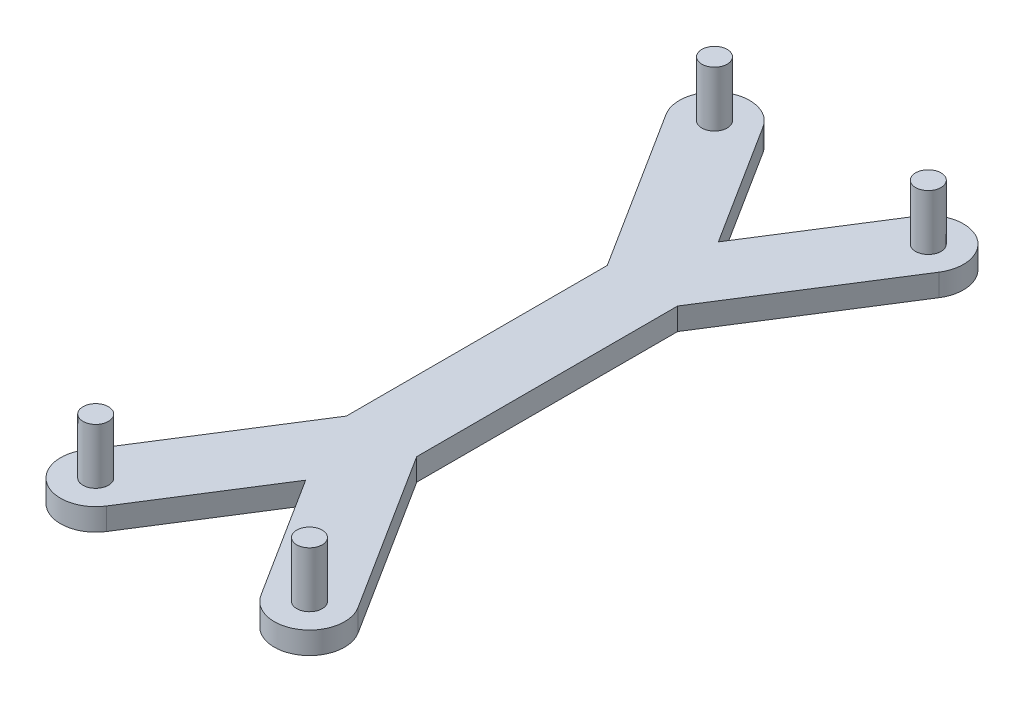
ISO-10303-21;
HEADER;
FILE_DESCRIPTION(('STEP AP214'),'2;1');
FILE_NAME('part.step','',(''),(''),'','','');
FILE_SCHEMA(('AUTOMOTIVE_DESIGN { 1 0 10303 214 1 1 1 1 }'));
ENDSEC;
DATA;
#1=APPLICATION_CONTEXT('core data for automotive mechanical design processes');
#2=APPLICATION_PROTOCOL_DEFINITION('international standard','automotive_design',2000,#1);
#3=PRODUCT_CONTEXT('',#1,'mechanical');
#4=PRODUCT('Part','Part','',(#3));
#5=PRODUCT_RELATED_PRODUCT_CATEGORY('part','',(#4));
#6=PRODUCT_DEFINITION_FORMATION('','',#4);
#7=PRODUCT_DEFINITION_CONTEXT('part definition',#1,'design');
#8=PRODUCT_DEFINITION('design','',#6,#7);
#9=PRODUCT_DEFINITION_SHAPE('','',#8);
#10=(LENGTH_UNIT() NAMED_UNIT(*) SI_UNIT(.MILLI.,.METRE.));
#11=(NAMED_UNIT(*) PLANE_ANGLE_UNIT() SI_UNIT($,.RADIAN.));
#12=(NAMED_UNIT(*) SI_UNIT($,.STERADIAN.) SOLID_ANGLE_UNIT());
#13=UNCERTAINTY_MEASURE_WITH_UNIT(LENGTH_MEASURE(1.E-05),#10,'distance_accuracy_value','');
#14=(GEOMETRIC_REPRESENTATION_CONTEXT(3) GLOBAL_UNCERTAINTY_ASSIGNED_CONTEXT((#13)) GLOBAL_UNIT_ASSIGNED_CONTEXT((#10,
#11,#12)) REPRESENTATION_CONTEXT('',''));
#15=CARTESIAN_POINT('',(0.,0.,0.));
#16=DIRECTION('',(0.,0.,1.));
#17=DIRECTION('',(1.,0.,0.));
#18=AXIS2_PLACEMENT_3D('',#15,#16,#17);
#19=CARTESIAN_POINT('',(8.42298256329863,-2.,5.33455562342247));
#20=DIRECTION('',(0.844819075554229,0.,0.535052081184345));
#21=DIRECTION('',(0.535052081184345,0.,-0.844819075554229));
#22=AXIS2_PLACEMENT_3D('',#19,#20,#21);
#23=PLANE('',#22);
#24=DIRECTION('',(0.535052081184345,0.,-0.844819075554229));
#25=VECTOR('',#24,1.);
#26=CARTESIAN_POINT('',(8.42298256329863,0.,5.33455562342247));
#27=LINE('',#26,#25);
#28=CARTESIAN_POINT('',(-6.96969943511532,0.,29.6387903577603));
#29=VERTEX_POINT('',#28);
#30=CARTESIAN_POINT('',(0.,0.,18.6340017759993));
#31=VERTEX_POINT('',#30);
#32=EDGE_CURVE('E205',#29,#31,#27,.T.);
#33=ORIENTED_EDGE('',*,*,#32,.F.);
#34=DIRECTION('',(0.,1.,0.));
#35=VECTOR('',#34,1.);
#36=CARTESIAN_POINT('',(-6.96969943511532,-2.,29.6387903577603));
#37=LINE('',#36,#35);
#38=CARTESIAN_POINT('',(-6.96969943511532,-2.,29.6387903577603));
#39=VERTEX_POINT('',#38);
#40=EDGE_CURVE('E12',#39,#29,#37,.T.);
#41=ORIENTED_EDGE('',*,*,#40,.F.);
#42=DIRECTION('',(0.535052081184345,0.,-0.844819075554229));
#43=VECTOR('',#42,1.);
#44=CARTESIAN_POINT('',(8.42298256329863,-2.,5.33455562342247));
#45=LINE('',#44,#43);
#46=CARTESIAN_POINT('',(0.,-2.,18.6340017759993));
#47=VERTEX_POINT('',#46);
#48=EDGE_CURVE('E267',#39,#47,#45,.T.);
#49=ORIENTED_EDGE('',*,*,#48,.T.);
#50=DIRECTION('',(0.,1.,0.));
#51=VECTOR('',#50,1.);
#52=CARTESIAN_POINT('',(0.,-2.,18.6340017759993));
#53=LINE('',#52,#51);
#54=EDGE_CURVE('E51',#47,#31,#53,.T.);
#55=ORIENTED_EDGE('',*,*,#54,.T.);
#56=EDGE_LOOP('',(#33,#41,#49,#55));
#57=FACE_BOUND('',#56,.T.);
#58=ADVANCED_FACE('F48',(#57),#23,.T.);
#59=CARTESIAN_POINT('',(-9.652,-2.,27.94));
#60=DIRECTION('',(0.,1.,0.));
#61=DIRECTION('',(0.,0.,1.));
#62=AXIS2_PLACEMENT_3D('',#59,#60,#61);
#63=CYLINDRICAL_SURFACE('',#62,3.175);
#64=CARTESIAN_POINT('',(-9.652,0.,27.94));
#65=DIRECTION('',(0.,1.,0.));
#66=DIRECTION('',(0.,0.,1.));
#67=AXIS2_PLACEMENT_3D('',#64,#65,#66);
#68=CIRCLE('',#67,3.175);
#69=CARTESIAN_POINT('',(-12.3343005648847,0.,26.2412096422397));
#70=VERTEX_POINT('',#69);
#71=EDGE_CURVE('E112',#29,#70,#68,.F.);
#72=ORIENTED_EDGE('',*,*,#71,.T.);
#73=DIRECTION('',(0.,1.,0.));
#74=VECTOR('',#73,1.);
#75=CARTESIAN_POINT('',(-12.3343005648847,-2.,26.2412096422397));
#76=LINE('',#75,#74);
#77=CARTESIAN_POINT('',(-12.3343005648847,-2.,26.2412096422397));
#78=VERTEX_POINT('',#77);
#79=EDGE_CURVE('E58',#78,#70,#76,.T.);
#80=ORIENTED_EDGE('',*,*,#79,.F.);
#81=CARTESIAN_POINT('',(-9.652,-2.,27.94));
#82=DIRECTION('',(0.,1.,0.));
#83=DIRECTION('',(0.,0.,1.));
#84=AXIS2_PLACEMENT_3D('',#81,#82,#83);
#85=CIRCLE('',#84,3.175);
#86=EDGE_CURVE('E163',#39,#78,#85,.F.);
#87=ORIENTED_EDGE('',*,*,#86,.F.);
#88=ORIENTED_EDGE('',*,*,#40,.T.);
#89=EDGE_LOOP('',(#72,#80,#87,#88));
#90=FACE_BOUND('',#89,.T.);
#91=ADVANCED_FACE('F387',(#90),#63,.T.);
#92=CARTESIAN_POINT('',(3.05838143352928,-2.,1.93697490790188));
#93=DIRECTION('',(0.844819075554229,0.,0.535052081184345));
#94=DIRECTION('',(0.535052081184345,0.,-0.844819075554229));
#95=AXIS2_PLACEMENT_3D('',#92,#93,#94);
#96=PLANE('',#95);
#97=DIRECTION('',(0.535052081184345,0.,-0.844819075554229));
#98=VECTOR('',#97,1.);
#99=CARTESIAN_POINT('',(3.05838143352928,0.,1.93697490790188));
#100=LINE('',#99,#98);
#101=CARTESIAN_POINT('',(-3.175,0.,11.7791561187376));
#102=VERTEX_POINT('',#101);
#103=EDGE_CURVE('E171',#70,#102,#100,.T.);
#104=ORIENTED_EDGE('',*,*,#103,.T.);
#105=DIRECTION('',(0.,1.,0.));
#106=VECTOR('',#105,1.);
#107=CARTESIAN_POINT('',(-3.175,-2.,11.7791561187376));
#108=LINE('',#107,#106);
#109=CARTESIAN_POINT('',(-3.175,-2.,11.7791561187376));
#110=VERTEX_POINT('',#109);
#111=EDGE_CURVE('E168',#110,#102,#108,.T.);
#112=ORIENTED_EDGE('',*,*,#111,.F.);
#113=DIRECTION('',(0.535052081184345,0.,-0.844819075554229));
#114=VECTOR('',#113,1.);
#115=CARTESIAN_POINT('',(3.05838143352928,-2.,1.93697490790188));
#116=LINE('',#115,#114);
#117=EDGE_CURVE('E155',#78,#110,#116,.T.);
#118=ORIENTED_EDGE('',*,*,#117,.F.);
#119=ORIENTED_EDGE('',*,*,#79,.T.);
#120=EDGE_LOOP('',(#104,#112,#118,#119));
#121=FACE_BOUND('',#120,.T.);
#122=ADVANCED_FACE('F169',(#121),#96,.F.);
#123=CARTESIAN_POINT('',(-3.175,-2.,0.));
#124=DIRECTION('',(-1.,0.,0.));
#125=DIRECTION('',(0.,0.,1.));
#126=AXIS2_PLACEMENT_3D('',#123,#124,#125);
#127=PLANE('',#126);
#128=DIRECTION('',(0.,0.,1.));
#129=VECTOR('',#128,1.);
#130=CARTESIAN_POINT('',(-3.175,0.,0.));
#131=LINE('',#130,#129);
#132=CARTESIAN_POINT('',(-3.175,0.,-11.7791561187376));
#133=VERTEX_POINT('',#132);
#134=EDGE_CURVE('E245',#133,#102,#131,.T.);
#135=ORIENTED_EDGE('',*,*,#134,.F.);
#136=DIRECTION('',(0.,1.,0.));
#137=VECTOR('',#136,1.);
#138=CARTESIAN_POINT('',(-3.175,-2.,-11.7791561187376));
#139=LINE('',#138,#137);
#140=CARTESIAN_POINT('',(-3.175,-2.,-11.7791561187376));
#141=VERTEX_POINT('',#140);
#142=EDGE_CURVE('E176',#141,#133,#139,.T.);
#143=ORIENTED_EDGE('',*,*,#142,.F.);
#144=DIRECTION('',(0.,0.,1.));
#145=VECTOR('',#144,1.);
#146=CARTESIAN_POINT('',(-3.175,-2.,0.));
#147=LINE('',#146,#145);
#148=EDGE_CURVE('E161',#141,#110,#147,.T.);
#149=ORIENTED_EDGE('',*,*,#148,.T.);
#150=ORIENTED_EDGE('',*,*,#111,.T.);
#151=EDGE_LOOP('',(#135,#143,#149,#150));
#152=FACE_BOUND('',#151,.T.);
#153=ADVANCED_FACE('F178',(#152),#127,.T.);
#154=CARTESIAN_POINT('',(3.05838143352928,-2.,-1.93697490790188));
#155=DIRECTION('',(-0.844819075554229,0.,0.535052081184345));
#156=DIRECTION('',(0.535052081184345,0.,0.844819075554229));
#157=AXIS2_PLACEMENT_3D('',#154,#155,#156);
#158=PLANE('',#157);
#159=DIRECTION('',(0.535052081184345,0.,0.844819075554229));
#160=VECTOR('',#159,1.);
#161=CARTESIAN_POINT('',(3.05838143352928,0.,-1.93697490790188));
#162=LINE('',#161,#160);
#163=CARTESIAN_POINT('',(-12.3343005648847,0.,-26.2412096422397));
#164=VERTEX_POINT('',#163);
#165=EDGE_CURVE('E241',#164,#133,#162,.T.);
#166=ORIENTED_EDGE('',*,*,#165,.F.);
#167=DIRECTION('',(0.,1.,0.));
#168=VECTOR('',#167,1.);
#169=CARTESIAN_POINT('',(-12.3343005648847,-2.,-26.2412096422397));
#170=LINE('',#169,#168);
#171=CARTESIAN_POINT('',(-12.3343005648847,-2.,-26.2412096422397));
#172=VERTEX_POINT('',#171);
#173=EDGE_CURVE('E273',#172,#164,#170,.T.);
#174=ORIENTED_EDGE('',*,*,#173,.F.);
#175=DIRECTION('',(0.535052081184345,0.,0.844819075554229));
#176=VECTOR('',#175,1.);
#177=CARTESIAN_POINT('',(3.05838143352928,-2.,-1.93697490790188));
#178=LINE('',#177,#176);
#179=EDGE_CURVE('E180',#172,#141,#178,.T.);
#180=ORIENTED_EDGE('',*,*,#179,.T.);
#181=ORIENTED_EDGE('',*,*,#142,.T.);
#182=EDGE_LOOP('',(#166,#174,#180,#181));
#183=FACE_BOUND('',#182,.T.);
#184=ADVANCED_FACE('F315',(#183),#158,.T.);
#185=CARTESIAN_POINT('',(-9.652,-2.,-27.94));
#186=DIRECTION('',(0.,1.,0.));
#187=DIRECTION('',(0.,0.,1.));
#188=AXIS2_PLACEMENT_3D('',#185,#186,#187);
#189=CYLINDRICAL_SURFACE('',#188,3.175);
#190=CARTESIAN_POINT('',(-9.652,0.,-27.94));
#191=DIRECTION('',(0.,1.,0.));
#192=DIRECTION('',(0.,0.,1.));
#193=AXIS2_PLACEMENT_3D('',#190,#191,#192);
#194=CIRCLE('',#193,3.175);
#195=CARTESIAN_POINT('',(-6.96969943511533,0.,-29.6387903577603));
#196=VERTEX_POINT('',#195);
#197=EDGE_CURVE('E238',#164,#196,#194,.F.);
#198=ORIENTED_EDGE('',*,*,#197,.T.);
#199=DIRECTION('',(0.,1.,0.));
#200=VECTOR('',#199,1.);
#201=CARTESIAN_POINT('',(-6.96969943511533,-2.,-29.6387903577603));
#202=LINE('',#201,#200);
#203=CARTESIAN_POINT('',(-6.96969943511533,-2.,-29.6387903577603));
#204=VERTEX_POINT('',#203);
#205=EDGE_CURVE('E276',#204,#196,#202,.T.);
#206=ORIENTED_EDGE('',*,*,#205,.F.);
#207=CARTESIAN_POINT('',(-9.652,-2.,-27.94));
#208=DIRECTION('',(0.,1.,0.));
#209=DIRECTION('',(0.,0.,1.));
#210=AXIS2_PLACEMENT_3D('',#207,#208,#209);
#211=CIRCLE('',#210,3.175);
#212=EDGE_CURVE('E183',#172,#204,#211,.F.);
#213=ORIENTED_EDGE('',*,*,#212,.F.);
#214=ORIENTED_EDGE('',*,*,#173,.T.);
#215=EDGE_LOOP('',(#198,#206,#213,#214));
#216=FACE_BOUND('',#215,.T.);
#217=ADVANCED_FACE('F324',(#216),#189,.T.);
#218=CARTESIAN_POINT('',(8.42298256329864,-2.,-5.33455562342247));
#219=DIRECTION('',(-0.844819075554229,0.,0.535052081184345));
#220=DIRECTION('',(0.535052081184345,0.,0.844819075554229));
#221=AXIS2_PLACEMENT_3D('',#218,#219,#220);
#222=PLANE('',#221);
#223=DIRECTION('',(0.535052081184345,0.,0.844819075554229));
#224=VECTOR('',#223,1.);
#225=CARTESIAN_POINT('',(8.42298256329864,0.,-5.33455562342247));
#226=LINE('',#225,#224);
#227=CARTESIAN_POINT('',(0.,0.,-18.6340017759993));
#228=VERTEX_POINT('',#227);
#229=EDGE_CURVE('E234',#196,#228,#226,.T.);
#230=ORIENTED_EDGE('',*,*,#229,.T.);
#231=DIRECTION('',(0.,1.,0.));
#232=VECTOR('',#231,1.);
#233=CARTESIAN_POINT('',(0.,-2.,-18.6340017759993));
#234=LINE('',#233,#232);
#235=CARTESIAN_POINT('',(0.,-2.,-18.6340017759993));
#236=VERTEX_POINT('',#235);
#237=EDGE_CURVE('E280',#236,#228,#234,.T.);
#238=ORIENTED_EDGE('',*,*,#237,.F.);
#239=DIRECTION('',(0.535052081184345,0.,0.844819075554229));
#240=VECTOR('',#239,1.);
#241=CARTESIAN_POINT('',(8.42298256329864,-2.,-5.33455562342247));
#242=LINE('',#241,#240);
#243=EDGE_CURVE('E320',#204,#236,#242,.T.);
#244=ORIENTED_EDGE('',*,*,#243,.F.);
#245=ORIENTED_EDGE('',*,*,#205,.T.);
#246=EDGE_LOOP('',(#230,#238,#244,#245));
#247=FACE_BOUND('',#246,.T.);
#248=ADVANCED_FACE('F326',(#247),#222,.F.);
#249=CARTESIAN_POINT('',(-8.42298256329864,-2.,-5.33455562342247));
#250=DIRECTION('',(-0.844819075554229,0.,-0.535052081184345));
#251=DIRECTION('',(-0.535052081184345,0.,0.844819075554229));
#252=AXIS2_PLACEMENT_3D('',#249,#250,#251);
#253=PLANE('',#252);
#254=DIRECTION('',(-0.535052081184345,0.,0.844819075554229));
#255=VECTOR('',#254,1.);
#256=CARTESIAN_POINT('',(-8.42298256329864,0.,-5.33455562342247));
#257=LINE('',#256,#255);
#258=CARTESIAN_POINT('',(6.96969943511532,0.,-29.6387903577603));
#259=VERTEX_POINT('',#258);
#260=EDGE_CURVE('E230',#259,#228,#257,.T.);
#261=ORIENTED_EDGE('',*,*,#260,.F.);
#262=DIRECTION('',(0.,1.,0.));
#263=VECTOR('',#262,1.);
#264=CARTESIAN_POINT('',(6.96969943511532,-2.,-29.6387903577603));
#265=LINE('',#264,#263);
#266=CARTESIAN_POINT('',(6.96969943511532,-2.,-29.6387903577603));
#267=VERTEX_POINT('',#266);
#268=EDGE_CURVE('E283',#267,#259,#265,.T.);
#269=ORIENTED_EDGE('',*,*,#268,.F.);
#270=DIRECTION('',(-0.535052081184345,0.,0.844819075554229));
#271=VECTOR('',#270,1.);
#272=CARTESIAN_POINT('',(-8.42298256329864,-2.,-5.33455562342247));
#273=LINE('',#272,#271);
#274=EDGE_CURVE('E329',#267,#236,#273,.T.);
#275=ORIENTED_EDGE('',*,*,#274,.T.);
#276=ORIENTED_EDGE('',*,*,#237,.T.);
#277=EDGE_LOOP('',(#261,#269,#275,#276));
#278=FACE_BOUND('',#277,.T.);
#279=ADVANCED_FACE('F377',(#278),#253,.T.);
#280=CARTESIAN_POINT('',(9.652,-2.,-27.94));
#281=DIRECTION('',(0.,1.,0.));
#282=DIRECTION('',(0.,0.,1.));
#283=AXIS2_PLACEMENT_3D('',#280,#281,#282);
#284=CYLINDRICAL_SURFACE('',#283,3.175);
#285=CARTESIAN_POINT('',(9.652,0.,-27.94));
#286=DIRECTION('',(0.,1.,0.));
#287=DIRECTION('',(0.,0.,1.));
#288=AXIS2_PLACEMENT_3D('',#285,#286,#287);
#289=CIRCLE('',#288,3.175);
#290=CARTESIAN_POINT('',(12.3343005648847,0.,-26.2412096422397));
#291=VERTEX_POINT('',#290);
#292=EDGE_CURVE('E227',#259,#291,#289,.F.);
#293=ORIENTED_EDGE('',*,*,#292,.T.);
#294=DIRECTION('',(0.,1.,0.));
#295=VECTOR('',#294,1.);
#296=CARTESIAN_POINT('',(12.3343005648847,-2.,-26.2412096422397));
#297=LINE('',#296,#295);
#298=CARTESIAN_POINT('',(12.3343005648847,-2.,-26.2412096422397));
#299=VERTEX_POINT('',#298);
#300=EDGE_CURVE('E286',#299,#291,#297,.T.);
#301=ORIENTED_EDGE('',*,*,#300,.F.);
#302=CARTESIAN_POINT('',(9.652,-2.,-27.94));
#303=DIRECTION('',(0.,1.,0.));
#304=DIRECTION('',(0.,0.,1.));
#305=AXIS2_PLACEMENT_3D('',#302,#303,#304);
#306=CIRCLE('',#305,3.175);
#307=EDGE_CURVE('E332',#267,#299,#306,.F.);
#308=ORIENTED_EDGE('',*,*,#307,.F.);
#309=ORIENTED_EDGE('',*,*,#268,.T.);
#310=EDGE_LOOP('',(#293,#301,#308,#309));
#311=FACE_BOUND('',#310,.T.);
#312=ADVANCED_FACE('F375',(#311),#284,.T.);
#313=CARTESIAN_POINT('',(-3.05838143352929,-2.,-1.93697490790188));
#314=DIRECTION('',(-0.844819075554229,0.,-0.535052081184345));
#315=DIRECTION('',(-0.535052081184345,0.,0.844819075554229));
#316=AXIS2_PLACEMENT_3D('',#313,#314,#315);
#317=PLANE('',#316);
#318=DIRECTION('',(-0.535052081184345,0.,0.844819075554229));
#319=VECTOR('',#318,1.);
#320=CARTESIAN_POINT('',(-3.05838143352929,0.,-1.93697490790188));
#321=LINE('',#320,#319);
#322=CARTESIAN_POINT('',(3.175,0.,-11.7791561187376));
#323=VERTEX_POINT('',#322);
#324=EDGE_CURVE('E224',#291,#323,#321,.T.);
#325=ORIENTED_EDGE('',*,*,#324,.T.);
#326=DIRECTION('',(0.,1.,0.));
#327=VECTOR('',#326,1.);
#328=CARTESIAN_POINT('',(3.175,-2.,-11.7791561187376));
#329=LINE('',#328,#327);
#330=CARTESIAN_POINT('',(3.175,-2.,-11.7791561187376));
#331=VERTEX_POINT('',#330);
#332=EDGE_CURVE('E290',#331,#323,#329,.T.);
#333=ORIENTED_EDGE('',*,*,#332,.F.);
#334=DIRECTION('',(-0.535052081184345,0.,0.844819075554229));
#335=VECTOR('',#334,1.);
#336=CARTESIAN_POINT('',(-3.05838143352929,-2.,-1.93697490790188));
#337=LINE('',#336,#335);
#338=EDGE_CURVE('E337',#299,#331,#337,.T.);
#339=ORIENTED_EDGE('',*,*,#338,.F.);
#340=ORIENTED_EDGE('',*,*,#300,.T.);
#341=EDGE_LOOP('',(#325,#333,#339,#340));
#342=FACE_BOUND('',#341,.T.);
#343=ADVANCED_FACE('F370',(#342),#317,.F.);
#344=CARTESIAN_POINT('',(3.175,-2.,0.));
#345=DIRECTION('',(-1.,0.,0.));
#346=DIRECTION('',(0.,0.,1.));
#347=AXIS2_PLACEMENT_3D('',#344,#345,#346);
#348=PLANE('',#347);
#349=DIRECTION('',(0.,0.,1.));
#350=VECTOR('',#349,1.);
#351=CARTESIAN_POINT('',(3.175,0.,0.));
#352=LINE('',#351,#350);
#353=CARTESIAN_POINT('',(3.175,0.,11.7791561187376));
#354=VERTEX_POINT('',#353);
#355=EDGE_CURVE('E220',#323,#354,#352,.T.);
#356=ORIENTED_EDGE('',*,*,#355,.T.);
#357=DIRECTION('',(0.,1.,0.));
#358=VECTOR('',#357,1.);
#359=CARTESIAN_POINT('',(3.175,-2.,11.7791561187376));
#360=LINE('',#359,#358);
#361=CARTESIAN_POINT('',(3.175,-2.,11.7791561187376));
#362=VERTEX_POINT('',#361);
#363=EDGE_CURVE('E294',#362,#354,#360,.T.);
#364=ORIENTED_EDGE('',*,*,#363,.F.);
#365=DIRECTION('',(0.,0.,1.));
#366=VECTOR('',#365,1.);
#367=CARTESIAN_POINT('',(3.175,-2.,0.));
#368=LINE('',#367,#366);
#369=EDGE_CURVE('E340',#331,#362,#368,.T.);
#370=ORIENTED_EDGE('',*,*,#369,.F.);
#371=ORIENTED_EDGE('',*,*,#332,.T.);
#372=EDGE_LOOP('',(#356,#364,#370,#371));
#373=FACE_BOUND('',#372,.T.);
#374=ADVANCED_FACE('F364',(#373),#348,.F.);
#375=CARTESIAN_POINT('',(-3.05838143352928,-2.,1.93697490790188));
#376=DIRECTION('',(0.844819075554229,0.,-0.535052081184345));
#377=DIRECTION('',(-0.535052081184345,0.,-0.844819075554229));
#378=AXIS2_PLACEMENT_3D('',#375,#376,#377);
#379=PLANE('',#378);
#380=DIRECTION('',(-0.535052081184345,0.,-0.844819075554229));
#381=VECTOR('',#380,1.);
#382=CARTESIAN_POINT('',(-3.05838143352928,0.,1.93697490790188));
#383=LINE('',#382,#381);
#384=CARTESIAN_POINT('',(12.3343005648847,0.,26.2412096422397));
#385=VERTEX_POINT('',#384);
#386=EDGE_CURVE('E216',#385,#354,#383,.T.);
#387=ORIENTED_EDGE('',*,*,#386,.F.);
#388=DIRECTION('',(0.,1.,0.));
#389=VECTOR('',#388,1.);
#390=CARTESIAN_POINT('',(12.3343005648847,-2.,26.2412096422397));
#391=LINE('',#390,#389);
#392=CARTESIAN_POINT('',(12.3343005648847,-2.,26.2412096422397));
#393=VERTEX_POINT('',#392);
#394=EDGE_CURVE('E297',#393,#385,#391,.T.);
#395=ORIENTED_EDGE('',*,*,#394,.F.);
#396=DIRECTION('',(-0.535052081184345,0.,-0.844819075554229));
#397=VECTOR('',#396,1.);
#398=CARTESIAN_POINT('',(-3.05838143352928,-2.,1.93697490790188));
#399=LINE('',#398,#397);
#400=EDGE_CURVE('E343',#393,#362,#399,.T.);
#401=ORIENTED_EDGE('',*,*,#400,.T.);
#402=ORIENTED_EDGE('',*,*,#363,.T.);
#403=EDGE_LOOP('',(#387,#395,#401,#402));
#404=FACE_BOUND('',#403,.T.);
#405=ADVANCED_FACE('F360',(#404),#379,.T.);
#406=CARTESIAN_POINT('',(9.652,-2.,27.94));
#407=DIRECTION('',(0.,1.,0.));
#408=DIRECTION('',(0.,0.,1.));
#409=AXIS2_PLACEMENT_3D('',#406,#407,#408);
#410=CYLINDRICAL_SURFACE('',#409,3.175);
#411=CARTESIAN_POINT('',(9.652,0.,27.94));
#412=DIRECTION('',(0.,1.,0.));
#413=DIRECTION('',(0.,0.,1.));
#414=AXIS2_PLACEMENT_3D('',#411,#412,#413);
#415=CIRCLE('',#414,3.175);
#416=CARTESIAN_POINT('',(6.96969943511533,0.,29.6387903577603));
#417=VERTEX_POINT('',#416);
#418=EDGE_CURVE('E213',#385,#417,#415,.F.);
#419=ORIENTED_EDGE('',*,*,#418,.T.);
#420=DIRECTION('',(0.,1.,0.));
#421=VECTOR('',#420,1.);
#422=CARTESIAN_POINT('',(6.96969943511533,-2.,29.6387903577603));
#423=LINE('',#422,#421);
#424=CARTESIAN_POINT('',(6.96969943511533,-2.,29.6387903577603));
#425=VERTEX_POINT('',#424);
#426=EDGE_CURVE('E299',#425,#417,#423,.T.);
#427=ORIENTED_EDGE('',*,*,#426,.F.);
#428=CARTESIAN_POINT('',(9.652,-2.,27.94));
#429=DIRECTION('',(0.,1.,0.));
#430=DIRECTION('',(0.,0.,1.));
#431=AXIS2_PLACEMENT_3D('',#428,#429,#430);
#432=CIRCLE('',#431,3.175);
#433=EDGE_CURVE('E347',#393,#425,#432,.F.);
#434=ORIENTED_EDGE('',*,*,#433,.F.);
#435=ORIENTED_EDGE('',*,*,#394,.T.);
#436=EDGE_LOOP('',(#419,#427,#434,#435));
#437=FACE_BOUND('',#436,.T.);
#438=ADVANCED_FACE('F356',(#437),#410,.T.);
#439=CARTESIAN_POINT('',(-9.652,-2.,27.94));
#440=DIRECTION('',(0.,1.,0.));
#441=DIRECTION('',(0.,0.,1.));
#442=AXIS2_PLACEMENT_3D('',#439,#440,#441);
#443=CYLINDRICAL_SURFACE('',#442,1.15);
#444=CARTESIAN_POINT('',(-9.652,-2.,27.94));
#445=DIRECTION('',(0.,1.,0.));
#446=DIRECTION('',(0.,0.,1.));
#447=AXIS2_PLACEMENT_3D('',#444,#445,#446);
#448=CIRCLE('',#447,1.15);
#449=CARTESIAN_POINT('',(-9.652,-2.,29.09));
#450=VERTEX_POINT('',#449);
#451=EDGE_CURVE('E197',#450,#450,#448,.F.);
#452=ORIENTED_EDGE('',*,*,#451,.T.);
#453=EDGE_LOOP('',(#452));
#454=FACE_BOUND('',#453,.T.);
#455=CARTESIAN_POINT('',(-9.652,0.,27.94));
#456=DIRECTION('',(0.,1.,0.));
#457=DIRECTION('',(0.,0.,1.));
#458=AXIS2_PLACEMENT_3D('',#455,#456,#457);
#459=CIRCLE('',#458,1.15);
#460=CARTESIAN_POINT('',(-9.652,0.,29.09));
#461=VERTEX_POINT('',#460);
#462=EDGE_CURVE('E260',#461,#461,#459,.F.);
#463=ORIENTED_EDGE('',*,*,#462,.F.);
#464=EDGE_LOOP('',(#463));
#465=FACE_BOUND('',#464,.T.);
#466=ADVANCED_FACE('F456',(#454,#465),#443,.F.);
#467=CARTESIAN_POINT('',(9.652,-2.,-27.94));
#468=DIRECTION('',(0.,1.,0.));
#469=DIRECTION('',(0.,0.,1.));
#470=AXIS2_PLACEMENT_3D('',#467,#468,#469);
#471=CYLINDRICAL_SURFACE('',#470,1.15);
#472=CARTESIAN_POINT('',(9.652,-2.,-27.94));
#473=DIRECTION('',(0.,1.,0.));
#474=DIRECTION('',(0.,0.,1.));
#475=AXIS2_PLACEMENT_3D('',#472,#473,#474);
#476=CIRCLE('',#475,1.15);
#477=CARTESIAN_POINT('',(9.652,-2.,-26.79));
#478=VERTEX_POINT('',#477);
#479=EDGE_CURVE('E193',#478,#478,#476,.F.);
#480=ORIENTED_EDGE('',*,*,#479,.T.);
#481=EDGE_LOOP('',(#480));
#482=FACE_BOUND('',#481,.T.);
#483=CARTESIAN_POINT('',(9.652,0.,-27.94));
#484=DIRECTION('',(0.,1.,0.));
#485=DIRECTION('',(0.,0.,1.));
#486=AXIS2_PLACEMENT_3D('',#483,#484,#485);
#487=CIRCLE('',#486,1.15);
#488=CARTESIAN_POINT('',(9.652,0.,-26.79));
#489=VERTEX_POINT('',#488);
#490=EDGE_CURVE('E256',#489,#489,#487,.F.);
#491=ORIENTED_EDGE('',*,*,#490,.F.);
#492=EDGE_LOOP('',(#491));
#493=FACE_BOUND('',#492,.T.);
#494=ADVANCED_FACE('F465',(#482,#493),#471,.F.);
#495=CARTESIAN_POINT('',(-9.652,-2.,-27.94));
#496=DIRECTION('',(0.,1.,0.));
#497=DIRECTION('',(0.,0.,1.));
#498=AXIS2_PLACEMENT_3D('',#495,#496,#497);
#499=CYLINDRICAL_SURFACE('',#498,1.15);
#500=CARTESIAN_POINT('',(-9.652,-2.,-27.94));
#501=DIRECTION('',(0.,1.,0.));
#502=DIRECTION('',(0.,0.,1.));
#503=AXIS2_PLACEMENT_3D('',#500,#501,#502);
#504=CIRCLE('',#503,1.15);
#505=CARTESIAN_POINT('',(-9.652,-2.,-26.79));
#506=VERTEX_POINT('',#505);
#507=EDGE_CURVE('E189',#506,#506,#504,.T.);
#508=ORIENTED_EDGE('',*,*,#507,.F.);
#509=EDGE_LOOP('',(#508));
#510=FACE_BOUND('',#509,.T.);
#511=CARTESIAN_POINT('',(-9.652,0.,-27.94));
#512=DIRECTION('',(0.,1.,0.));
#513=DIRECTION('',(0.,0.,1.));
#514=AXIS2_PLACEMENT_3D('',#511,#512,#513);
#515=CIRCLE('',#514,1.15);
#516=CARTESIAN_POINT('',(-9.652,0.,-26.79));
#517=VERTEX_POINT('',#516);
#518=EDGE_CURVE('E252',#517,#517,#515,.T.);
#519=ORIENTED_EDGE('',*,*,#518,.T.);
#520=EDGE_LOOP('',(#519));
#521=FACE_BOUND('',#520,.T.);
#522=ADVANCED_FACE('F397',(#510,#521),#499,.F.);
#523=CARTESIAN_POINT('',(-8.42298256329863,-2.,5.33455562342247));
#524=DIRECTION('',(0.844819075554229,0.,-0.535052081184345));
#525=DIRECTION('',(-0.535052081184345,0.,-0.844819075554229));
#526=AXIS2_PLACEMENT_3D('',#523,#524,#525);
#527=PLANE('',#526);
#528=DIRECTION('',(-0.535052081184345,0.,-0.844819075554229));
#529=VECTOR('',#528,1.);
#530=CARTESIAN_POINT('',(-8.42298256329863,0.,5.33455562342247));
#531=LINE('',#530,#529);
#532=EDGE_CURVE('E209',#417,#31,#531,.T.);
#533=ORIENTED_EDGE('',*,*,#532,.T.);
#534=ORIENTED_EDGE('',*,*,#54,.F.);
#535=DIRECTION('',(-0.535052081184345,0.,-0.844819075554229));
#536=VECTOR('',#535,1.);
#537=CARTESIAN_POINT('',(-8.42298256329863,-2.,5.33455562342247));
#538=LINE('',#537,#536);
#539=EDGE_CURVE('E122',#425,#47,#538,.T.);
#540=ORIENTED_EDGE('',*,*,#539,.F.);
#541=ORIENTED_EDGE('',*,*,#426,.T.);
#542=EDGE_LOOP('',(#533,#534,#540,#541));
#543=FACE_BOUND('',#542,.T.);
#544=ADVANCED_FACE('F306',(#543),#527,.F.);
#545=CARTESIAN_POINT('',(9.652,-2.,27.94));
#546=DIRECTION('',(0.,1.,0.));
#547=DIRECTION('',(0.,0.,1.));
#548=AXIS2_PLACEMENT_3D('',#545,#546,#547);
#549=CYLINDRICAL_SURFACE('',#548,1.15);
#550=CARTESIAN_POINT('',(9.652,-2.,27.94));
#551=DIRECTION('',(0.,1.,0.));
#552=DIRECTION('',(0.,0.,1.));
#553=AXIS2_PLACEMENT_3D('',#550,#551,#552);
#554=CIRCLE('',#553,1.15);
#555=CARTESIAN_POINT('',(9.652,-2.,29.09));
#556=VERTEX_POINT('',#555);
#557=EDGE_CURVE('E201',#556,#556,#554,.T.);
#558=ORIENTED_EDGE('',*,*,#557,.F.);
#559=EDGE_LOOP('',(#558));
#560=FACE_BOUND('',#559,.T.);
#561=CARTESIAN_POINT('',(9.652,0.,27.94));
#562=DIRECTION('',(0.,1.,0.));
#563=DIRECTION('',(0.,0.,1.));
#564=AXIS2_PLACEMENT_3D('',#561,#562,#563);
#565=CIRCLE('',#564,1.15);
#566=CARTESIAN_POINT('',(9.652,0.,29.09));
#567=VERTEX_POINT('',#566);
#568=EDGE_CURVE('E264',#567,#567,#565,.T.);
#569=ORIENTED_EDGE('',*,*,#568,.T.);
#570=EDGE_LOOP('',(#569));
#571=FACE_BOUND('',#570,.T.);
#572=ADVANCED_FACE('F491',(#560,#571),#549,.F.);
#573=CARTESIAN_POINT('',(0.,-2.,0.));
#574=DIRECTION('',(0.,1.,0.));
#575=DIRECTION('',(0.,0.,1.));
#576=AXIS2_PLACEMENT_3D('',#573,#574,#575);
#577=PLANE('',#576);
#578=ORIENTED_EDGE('',*,*,#48,.F.);
#579=ORIENTED_EDGE('',*,*,#86,.T.);
#580=ORIENTED_EDGE('',*,*,#117,.T.);
#581=ORIENTED_EDGE('',*,*,#148,.F.);
#582=ORIENTED_EDGE('',*,*,#179,.F.);
#583=ORIENTED_EDGE('',*,*,#212,.T.);
#584=ORIENTED_EDGE('',*,*,#243,.T.);
#585=ORIENTED_EDGE('',*,*,#274,.F.);
#586=ORIENTED_EDGE('',*,*,#307,.T.);
#587=ORIENTED_EDGE('',*,*,#338,.T.);
#588=ORIENTED_EDGE('',*,*,#369,.T.);
#589=ORIENTED_EDGE('',*,*,#400,.F.);
#590=ORIENTED_EDGE('',*,*,#433,.T.);
#591=ORIENTED_EDGE('',*,*,#539,.T.);
#592=EDGE_LOOP('',(#578,#579,#580,#581,#582,#583,#584,#585,#586,#587,#588,#589,#590,#591));
#593=FACE_BOUND('',#592,.T.);
#594=ORIENTED_EDGE('',*,*,#507,.T.);
#595=EDGE_LOOP('',(#594));
#596=FACE_BOUND('',#595,.T.);
#597=ORIENTED_EDGE('',*,*,#479,.F.);
#598=EDGE_LOOP('',(#597));
#599=FACE_BOUND('',#598,.T.);
#600=ORIENTED_EDGE('',*,*,#451,.F.);
#601=EDGE_LOOP('',(#600));
#602=FACE_BOUND('',#601,.T.);
#603=ORIENTED_EDGE('',*,*,#557,.T.);
#604=EDGE_LOOP('',(#603));
#605=FACE_BOUND('',#604,.T.);
#606=ADVANCED_FACE('F157',(#593,#596,#599,#602,#605),#577,.F.);
#607=CARTESIAN_POINT('',(0.,0.,0.));
#608=DIRECTION('',(0.,1.,0.));
#609=DIRECTION('',(0.,0.,1.));
#610=AXIS2_PLACEMENT_3D('',#607,#608,#609);
#611=PLANE('',#610);
#612=ORIENTED_EDGE('',*,*,#32,.T.);
#613=ORIENTED_EDGE('',*,*,#532,.F.);
#614=ORIENTED_EDGE('',*,*,#418,.F.);
#615=ORIENTED_EDGE('',*,*,#386,.T.);
#616=ORIENTED_EDGE('',*,*,#355,.F.);
#617=ORIENTED_EDGE('',*,*,#324,.F.);
#618=ORIENTED_EDGE('',*,*,#292,.F.);
#619=ORIENTED_EDGE('',*,*,#260,.T.);
#620=ORIENTED_EDGE('',*,*,#229,.F.);
#621=ORIENTED_EDGE('',*,*,#197,.F.);
#622=ORIENTED_EDGE('',*,*,#165,.T.);
#623=ORIENTED_EDGE('',*,*,#134,.T.);
#624=ORIENTED_EDGE('',*,*,#103,.F.);
#625=ORIENTED_EDGE('',*,*,#71,.F.);
#626=EDGE_LOOP('',(#612,#613,#614,#615,#616,#617,#618,#619,#620,#621,#622,#623,#624,#625));
#627=FACE_BOUND('',#626,.T.);
#628=ORIENTED_EDGE('',*,*,#518,.F.);
#629=EDGE_LOOP('',(#628));
#630=FACE_BOUND('',#629,.T.);
#631=ORIENTED_EDGE('',*,*,#490,.T.);
#632=EDGE_LOOP('',(#631));
#633=FACE_BOUND('',#632,.T.);
#634=ORIENTED_EDGE('',*,*,#462,.T.);
#635=EDGE_LOOP('',(#634));
#636=FACE_BOUND('',#635,.T.);
#637=ORIENTED_EDGE('',*,*,#568,.F.);
#638=EDGE_LOOP('',(#637));
#639=FACE_BOUND('',#638,.T.);
#640=ADVANCED_FACE('F309',(#627,#630,#633,#636,#639),#611,.T.);
#641=CLOSED_SHELL('',(#58,#91,#122,#153,#184,#217,#248,#279,#312,#343,#374,#405,#438,#466,#494,
#522,#544,#572,#606,#640));
#642=MANIFOLD_SOLID_BREP('B2',#641);
#643=CARTESIAN_POINT('',(-9.652,5.,27.94));
#644=DIRECTION('',(0.,-1.,0.));
#645=DIRECTION('',(0.,0.,-1.));
#646=AXIS2_PLACEMENT_3D('',#643,#644,#645);
#647=CYLINDRICAL_SURFACE('',#646,1.15);
#648=CARTESIAN_POINT('',(-9.652,5.,27.94));
#649=DIRECTION('',(0.,-1.,0.));
#650=DIRECTION('',(0.,0.,-1.));
#651=AXIS2_PLACEMENT_3D('',#648,#649,#650);
#652=CIRCLE('',#651,1.15);
#653=CARTESIAN_POINT('',(-9.652,5.,26.79));
#654=VERTEX_POINT('',#653);
#655=EDGE_CURVE('E602',#654,#654,#652,.T.);
#656=ORIENTED_EDGE('',*,*,#655,.T.);
#657=EDGE_LOOP('',(#656));
#658=FACE_BOUND('',#657,.T.);
#659=CARTESIAN_POINT('',(-9.652,0.,27.94));
#660=DIRECTION('',(0.,-1.,0.));
#661=DIRECTION('',(0.,0.,-1.));
#662=AXIS2_PLACEMENT_3D('',#659,#660,#661);
#663=CIRCLE('',#662,1.15);
#664=CARTESIAN_POINT('',(-9.652,0.,26.79));
#665=VERTEX_POINT('',#664);
#666=EDGE_CURVE('E47',#665,#665,#663,.T.);
#667=ORIENTED_EDGE('',*,*,#666,.F.);
#668=EDGE_LOOP('',(#667));
#669=FACE_BOUND('',#668,.T.);
#670=ADVANCED_FACE('F598',(#658,#669),#647,.T.);
#671=CARTESIAN_POINT('',(-9.652,5.,27.94));
#672=DIRECTION('',(0.,-1.,0.));
#673=DIRECTION('',(0.,0.,-1.));
#674=AXIS2_PLACEMENT_3D('',#671,#672,#673);
#675=PLANE('',#674);
#676=ORIENTED_EDGE('',*,*,#655,.F.);
#677=EDGE_LOOP('',(#676));
#678=FACE_BOUND('',#677,.T.);
#679=ADVANCED_FACE('F600',(#678),#675,.F.);
#680=CARTESIAN_POINT('',(-9.652,0.,27.94));
#681=DIRECTION('',(0.,-1.,0.));
#682=DIRECTION('',(0.,0.,-1.));
#683=AXIS2_PLACEMENT_3D('',#680,#681,#682);
#684=PLANE('',#683);
#685=ORIENTED_EDGE('',*,*,#666,.T.);
#686=EDGE_LOOP('',(#685));
#687=FACE_BOUND('',#686,.T.);
#688=ADVANCED_FACE('F614',(#687),#684,.T.);
#689=CLOSED_SHELL('',(#670,#679,#688));
#690=MANIFOLD_SOLID_BREP('B6',#689);
#691=CARTESIAN_POINT('',(9.652,5.,27.94));
#692=DIRECTION('',(0.,-1.,0.));
#693=DIRECTION('',(0.,0.,-1.));
#694=AXIS2_PLACEMENT_3D('',#691,#692,#693);
#695=CYLINDRICAL_SURFACE('',#694,1.15);
#696=CARTESIAN_POINT('',(9.652,5.,27.94));
#697=DIRECTION('',(0.,1.,0.));
#698=DIRECTION('',(0.,0.,1.));
#699=AXIS2_PLACEMENT_3D('',#696,#697,#698);
#700=CIRCLE('',#699,1.15);
#701=CARTESIAN_POINT('',(9.652,5.,29.09));
#702=VERTEX_POINT('',#701);
#703=EDGE_CURVE('E651',#702,#702,#700,.T.);
#704=ORIENTED_EDGE('',*,*,#703,.F.);
#705=EDGE_LOOP('',(#704));
#706=FACE_BOUND('',#705,.T.);
#707=CARTESIAN_POINT('',(9.652,0.,27.94));
#708=DIRECTION('',(0.,1.,0.));
#709=DIRECTION('',(0.,0.,1.));
#710=AXIS2_PLACEMENT_3D('',#707,#708,#709);
#711=CIRCLE('',#710,1.15);
#712=CARTESIAN_POINT('',(9.652,0.,29.09));
#713=VERTEX_POINT('',#712);
#714=EDGE_CURVE('E597',#713,#713,#711,.T.);
#715=ORIENTED_EDGE('',*,*,#714,.T.);
#716=EDGE_LOOP('',(#715));
#717=FACE_BOUND('',#716,.T.);
#718=ADVANCED_FACE('F647',(#706,#717),#695,.T.);
#719=CARTESIAN_POINT('',(9.652,5.,27.94));
#720=DIRECTION('',(0.,1.,0.));
#721=DIRECTION('',(0.,0.,1.));
#722=AXIS2_PLACEMENT_3D('',#719,#720,#721);
#723=PLANE('',#722);
#724=ORIENTED_EDGE('',*,*,#703,.T.);
#725=EDGE_LOOP('',(#724));
#726=FACE_BOUND('',#725,.T.);
#727=ADVANCED_FACE('F649',(#726),#723,.T.);
#728=CARTESIAN_POINT('',(9.652,0.,27.94));
#729=DIRECTION('',(0.,1.,0.));
#730=DIRECTION('',(0.,0.,1.));
#731=AXIS2_PLACEMENT_3D('',#728,#729,#730);
#732=PLANE('',#731);
#733=ORIENTED_EDGE('',*,*,#714,.F.);
#734=EDGE_LOOP('',(#733));
#735=FACE_BOUND('',#734,.T.);
#736=ADVANCED_FACE('F666',(#735),#732,.F.);
#737=CLOSED_SHELL('',(#718,#727,#736));
#738=MANIFOLD_SOLID_BREP('B42',#737);
#739=CARTESIAN_POINT('',(9.652,5.,-27.94));
#740=DIRECTION('',(0.,-1.,0.));
#741=DIRECTION('',(0.,0.,-1.));
#742=AXIS2_PLACEMENT_3D('',#739,#740,#741);
#743=CYLINDRICAL_SURFACE('',#742,1.15);
#744=CARTESIAN_POINT('',(9.652,5.,-27.94));
#745=DIRECTION('',(0.,-1.,0.));
#746=DIRECTION('',(0.,0.,-1.));
#747=AXIS2_PLACEMENT_3D('',#744,#745,#746);
#748=CIRCLE('',#747,1.15);
#749=CARTESIAN_POINT('',(9.652,5.,-29.09));
#750=VERTEX_POINT('',#749);
#751=EDGE_CURVE('E699',#750,#750,#748,.T.);
#752=ORIENTED_EDGE('',*,*,#751,.T.);
#753=EDGE_LOOP('',(#752));
#754=FACE_BOUND('',#753,.T.);
#755=CARTESIAN_POINT('',(9.652,0.,-27.94));
#756=DIRECTION('',(0.,-1.,0.));
#757=DIRECTION('',(0.,0.,-1.));
#758=AXIS2_PLACEMENT_3D('',#755,#756,#757);
#759=CIRCLE('',#758,1.15);
#760=CARTESIAN_POINT('',(9.652,0.,-29.09));
#761=VERTEX_POINT('',#760);
#762=EDGE_CURVE('E646',#761,#761,#759,.T.);
#763=ORIENTED_EDGE('',*,*,#762,.F.);
#764=EDGE_LOOP('',(#763));
#765=FACE_BOUND('',#764,.T.);
#766=ADVANCED_FACE('F695',(#754,#765),#743,.T.);
#767=CARTESIAN_POINT('',(9.652,5.,-27.94));
#768=DIRECTION('',(0.,-1.,0.));
#769=DIRECTION('',(0.,0.,-1.));
#770=AXIS2_PLACEMENT_3D('',#767,#768,#769);
#771=PLANE('',#770);
#772=ORIENTED_EDGE('',*,*,#751,.F.);
#773=EDGE_LOOP('',(#772));
#774=FACE_BOUND('',#773,.T.);
#775=ADVANCED_FACE('F697',(#774),#771,.F.);
#776=CARTESIAN_POINT('',(9.652,0.,-27.94));
#777=DIRECTION('',(0.,-1.,0.));
#778=DIRECTION('',(0.,0.,-1.));
#779=AXIS2_PLACEMENT_3D('',#776,#777,#778);
#780=PLANE('',#779);
#781=ORIENTED_EDGE('',*,*,#762,.T.);
#782=EDGE_LOOP('',(#781));
#783=FACE_BOUND('',#782,.T.);
#784=ADVANCED_FACE('F711',(#783),#780,.T.);
#785=CLOSED_SHELL('',(#766,#775,#784));
#786=MANIFOLD_SOLID_BREP('B592',#785);
#787=CARTESIAN_POINT('',(-9.652,5.,-27.94));
#788=DIRECTION('',(0.,-1.,0.));
#789=DIRECTION('',(0.,0.,-1.));
#790=AXIS2_PLACEMENT_3D('',#787,#788,#789);
#791=CYLINDRICAL_SURFACE('',#790,1.15);
#792=CARTESIAN_POINT('',(-9.652,5.,-27.94));
#793=DIRECTION('',(0.,1.,0.));
#794=DIRECTION('',(0.,0.,1.));
#795=AXIS2_PLACEMENT_3D('',#792,#793,#794);
#796=CIRCLE('',#795,1.15);
#797=CARTESIAN_POINT('',(-9.652,5.,-26.79));
#798=VERTEX_POINT('',#797);
#799=EDGE_CURVE('E694',#798,#798,#796,.T.);
#800=ORIENTED_EDGE('',*,*,#799,.F.);
#801=EDGE_LOOP('',(#800));
#802=FACE_BOUND('',#801,.T.);
#803=CARTESIAN_POINT('',(-9.652,0.,-27.94));
#804=DIRECTION('',(0.,1.,0.));
#805=DIRECTION('',(0.,0.,1.));
#806=AXIS2_PLACEMENT_3D('',#803,#804,#805);
#807=CIRCLE('',#806,1.15);
#808=CARTESIAN_POINT('',(-9.652,0.,-26.79));
#809=VERTEX_POINT('',#808);
#810=EDGE_CURVE('E739',#809,#809,#807,.T.);
#811=ORIENTED_EDGE('',*,*,#810,.T.);
#812=EDGE_LOOP('',(#811));
#813=FACE_BOUND('',#812,.T.);
#814=ADVANCED_FACE('F736',(#802,#813),#791,.T.);
#815=CARTESIAN_POINT('',(-9.652,5.,-27.94));
#816=DIRECTION('',(0.,1.,0.));
#817=DIRECTION('',(0.,0.,1.));
#818=AXIS2_PLACEMENT_3D('',#815,#816,#817);
#819=PLANE('',#818);
#820=ORIENTED_EDGE('',*,*,#799,.T.);
#821=EDGE_LOOP('',(#820));
#822=FACE_BOUND('',#821,.T.);
#823=ADVANCED_FACE('F751',(#822),#819,.T.);
#824=CARTESIAN_POINT('',(-9.652,0.,-27.94));
#825=DIRECTION('',(0.,1.,0.));
#826=DIRECTION('',(0.,0.,1.));
#827=AXIS2_PLACEMENT_3D('',#824,#825,#826);
#828=PLANE('',#827);
#829=ORIENTED_EDGE('',*,*,#810,.F.);
#830=EDGE_LOOP('',(#829));
#831=FACE_BOUND('',#830,.T.);
#832=ADVANCED_FACE('F749',(#831),#828,.F.);
#833=CLOSED_SHELL('',(#814,#823,#832));
#834=MANIFOLD_SOLID_BREP('B641',#833);
#835=ADVANCED_BREP_SHAPE_REPRESENTATION('',(#18,#642,#690,#738,#786,#834),#14);
#836=SHAPE_DEFINITION_REPRESENTATION(#9,#835);
ENDSEC;
END-ISO-10303-21;
